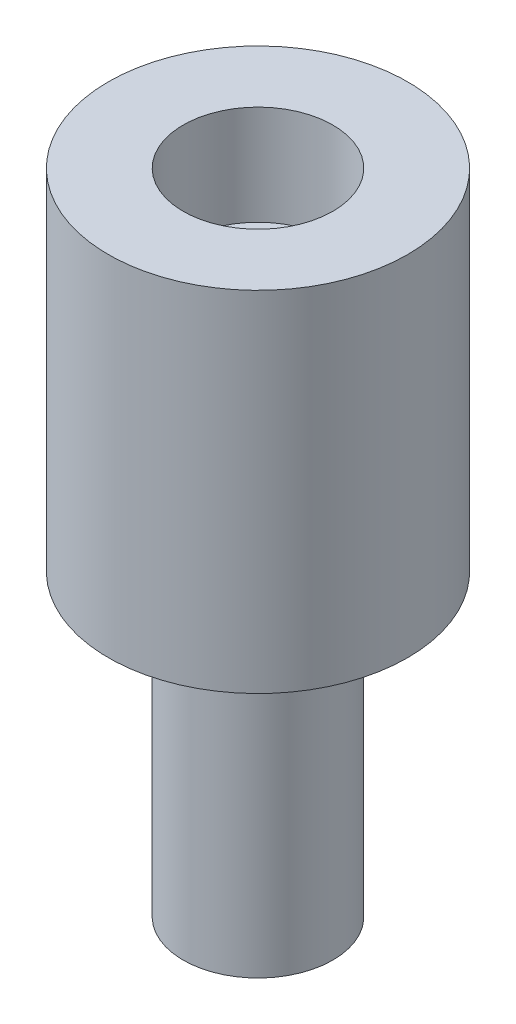
ISO-10303-21;
HEADER;
FILE_DESCRIPTION(('STEP AP214'),'2;1');
FILE_NAME('part.step','',(''),(''),'','','');
FILE_SCHEMA(('AUTOMOTIVE_DESIGN { 1 0 10303 214 1 1 1 1 }'));
ENDSEC;
DATA;
#1=APPLICATION_CONTEXT('core data for automotive mechanical design processes');
#2=APPLICATION_PROTOCOL_DEFINITION('international standard','automotive_design',2000,#1);
#3=PRODUCT_CONTEXT('',#1,'mechanical');
#4=PRODUCT('Part','Part','',(#3));
#5=PRODUCT_RELATED_PRODUCT_CATEGORY('part','',(#4));
#6=PRODUCT_DEFINITION_FORMATION('','',#4);
#7=PRODUCT_DEFINITION_CONTEXT('part definition',#1,'design');
#8=PRODUCT_DEFINITION('design','',#6,#7);
#9=PRODUCT_DEFINITION_SHAPE('','',#8);
#10=(LENGTH_UNIT() NAMED_UNIT(*) SI_UNIT(.MILLI.,.METRE.));
#11=(NAMED_UNIT(*) PLANE_ANGLE_UNIT() SI_UNIT($,.RADIAN.));
#12=(NAMED_UNIT(*) SI_UNIT($,.STERADIAN.) SOLID_ANGLE_UNIT());
#13=UNCERTAINTY_MEASURE_WITH_UNIT(LENGTH_MEASURE(1.E-05),#10,'distance_accuracy_value','');
#14=(GEOMETRIC_REPRESENTATION_CONTEXT(3) GLOBAL_UNCERTAINTY_ASSIGNED_CONTEXT((#13)) GLOBAL_UNIT_ASSIGNED_CONTEXT((#10,
#11,#12)) REPRESENTATION_CONTEXT('',''));
#15=CARTESIAN_POINT('',(0.,0.,0.));
#16=DIRECTION('',(0.,0.,1.));
#17=DIRECTION('',(1.,0.,0.));
#18=AXIS2_PLACEMENT_3D('',#15,#16,#17);
#19=CARTESIAN_POINT('',(0.,11.,0.));
#20=DIRECTION('',(0.,-1.,0.));
#21=DIRECTION('',(1.,0.,0.));
#22=AXIS2_PLACEMENT_3D('',#19,#20,#21);
#23=PLANE('',#22);
#24=CARTESIAN_POINT('',(0.,11.,0.));
#25=DIRECTION('',(0.,-1.,0.));
#26=DIRECTION('',(1.,0.,0.));
#27=AXIS2_PLACEMENT_3D('',#24,#25,#26);
#28=CIRCLE('',#27,1.5);
#29=CARTESIAN_POINT('',(1.5,11.,0.));
#30=VERTEX_POINT('',#29);
#31=EDGE_CURVE('E10',#30,#30,#28,.T.);
#32=ORIENTED_EDGE('',*,*,#31,.F.);
#33=EDGE_LOOP('',(#32));
#34=FACE_BOUND('',#33,.T.);
#35=ADVANCED_FACE('F34',(#34),#23,.F.);
#36=CARTESIAN_POINT('',(0.,0.,0.));
#37=DIRECTION('',(0.,-1.,0.));
#38=DIRECTION('',(1.,0.,0.));
#39=AXIS2_PLACEMENT_3D('',#36,#37,#38);
#40=CYLINDRICAL_SURFACE('',#39,1.5);
#41=CARTESIAN_POINT('',(0.,13.,0.));
#42=DIRECTION('',(0.,-1.,0.));
#43=DIRECTION('',(1.,0.,0.));
#44=AXIS2_PLACEMENT_3D('',#41,#42,#43);
#45=CIRCLE('',#44,1.5);
#46=CARTESIAN_POINT('',(1.5,13.,0.));
#47=VERTEX_POINT('',#46);
#48=EDGE_CURVE('E40',#47,#47,#45,.T.);
#49=ORIENTED_EDGE('',*,*,#48,.F.);
#50=EDGE_LOOP('',(#49));
#51=FACE_BOUND('',#50,.T.);
#52=ORIENTED_EDGE('',*,*,#31,.T.);
#53=EDGE_LOOP('',(#52));
#54=FACE_BOUND('',#53,.T.);
#55=ADVANCED_FACE('F82',(#51,#54),#40,.F.);
#56=CARTESIAN_POINT('',(-1.5,13.,0.));
#57=DIRECTION('',(0.,-1.,0.));
#58=DIRECTION('',(1.,0.,0.));
#59=AXIS2_PLACEMENT_3D('',#56,#57,#58);
#60=PLANE('',#59);
#61=CARTESIAN_POINT('',(0.,13.,0.));
#62=DIRECTION('',(0.,-1.,0.));
#63=DIRECTION('',(1.,0.,0.));
#64=AXIS2_PLACEMENT_3D('',#61,#62,#63);
#65=CIRCLE('',#64,3.);
#66=CARTESIAN_POINT('',(3.,13.,0.));
#67=VERTEX_POINT('',#66);
#68=EDGE_CURVE('E44',#67,#67,#65,.T.);
#69=ORIENTED_EDGE('',*,*,#68,.F.);
#70=EDGE_LOOP('',(#69));
#71=FACE_BOUND('',#70,.T.);
#72=ORIENTED_EDGE('',*,*,#48,.T.);
#73=EDGE_LOOP('',(#72));
#74=FACE_BOUND('',#73,.T.);
#75=ADVANCED_FACE('F77',(#71,#74),#60,.F.);
#76=CARTESIAN_POINT('',(0.,0.,0.));
#77=DIRECTION('',(0.,-1.,0.));
#78=DIRECTION('',(1.,0.,0.));
#79=AXIS2_PLACEMENT_3D('',#76,#77,#78);
#80=CYLINDRICAL_SURFACE('',#79,3.);
#81=CARTESIAN_POINT('',(0.,6.,0.));
#82=DIRECTION('',(0.,-1.,0.));
#83=DIRECTION('',(1.,0.,0.));
#84=AXIS2_PLACEMENT_3D('',#81,#82,#83);
#85=CIRCLE('',#84,3.);
#86=CARTESIAN_POINT('',(3.,6.,0.));
#87=VERTEX_POINT('',#86);
#88=EDGE_CURVE('E48',#87,#87,#85,.T.);
#89=ORIENTED_EDGE('',*,*,#88,.F.);
#90=EDGE_LOOP('',(#89));
#91=FACE_BOUND('',#90,.T.);
#92=ORIENTED_EDGE('',*,*,#68,.T.);
#93=EDGE_LOOP('',(#92));
#94=FACE_BOUND('',#93,.T.);
#95=ADVANCED_FACE('F71',(#91,#94),#80,.T.);
#96=CARTESIAN_POINT('',(-3.,6.,0.));
#97=DIRECTION('',(0.,1.,0.));
#98=DIRECTION('',(-1.,0.,0.));
#99=AXIS2_PLACEMENT_3D('',#96,#97,#98);
#100=PLANE('',#99);
#101=CARTESIAN_POINT('',(0.,6.,0.));
#102=DIRECTION('',(0.,-1.,0.));
#103=DIRECTION('',(1.,0.,0.));
#104=AXIS2_PLACEMENT_3D('',#101,#102,#103);
#105=CIRCLE('',#104,1.5);
#106=CARTESIAN_POINT('',(1.5,6.,0.));
#107=VERTEX_POINT('',#106);
#108=EDGE_CURVE('E53',#107,#107,#105,.T.);
#109=ORIENTED_EDGE('',*,*,#108,.F.);
#110=EDGE_LOOP('',(#109));
#111=FACE_BOUND('',#110,.T.);
#112=ORIENTED_EDGE('',*,*,#88,.T.);
#113=EDGE_LOOP('',(#112));
#114=FACE_BOUND('',#113,.T.);
#115=ADVANCED_FACE('F65',(#111,#114),#100,.F.);
#116=CARTESIAN_POINT('',(0.,0.,0.));
#117=DIRECTION('',(0.,-1.,0.));
#118=DIRECTION('',(1.,0.,0.));
#119=AXIS2_PLACEMENT_3D('',#116,#117,#118);
#120=CYLINDRICAL_SURFACE('',#119,1.50000000000001);
#121=CARTESIAN_POINT('',(0.,0.,0.));
#122=DIRECTION('',(0.,-1.,0.));
#123=DIRECTION('',(1.,0.,0.));
#124=AXIS2_PLACEMENT_3D('',#121,#122,#123);
#125=CIRCLE('',#124,1.50000000000001);
#126=CARTESIAN_POINT('',(1.50000000000001,0.,0.));
#127=VERTEX_POINT('',#126);
#128=EDGE_CURVE('E56',#127,#127,#125,.T.);
#129=ORIENTED_EDGE('',*,*,#128,.F.);
#130=EDGE_LOOP('',(#129));
#131=FACE_BOUND('',#130,.T.);
#132=ORIENTED_EDGE('',*,*,#108,.T.);
#133=EDGE_LOOP('',(#132));
#134=FACE_BOUND('',#133,.T.);
#135=ADVANCED_FACE('F62',(#131,#134),#120,.T.);
#136=CARTESIAN_POINT('',(-1.50000000000001,0.,0.));
#137=DIRECTION('',(0.,1.,0.));
#138=DIRECTION('',(-1.,0.,0.));
#139=AXIS2_PLACEMENT_3D('',#136,#137,#138);
#140=PLANE('',#139);
#141=ORIENTED_EDGE('',*,*,#128,.T.);
#142=EDGE_LOOP('',(#141));
#143=FACE_BOUND('',#142,.T.);
#144=ADVANCED_FACE('F60',(#143),#140,.F.);
#145=CLOSED_SHELL('',(#35,#55,#75,#95,#115,#135,#144));
#146=MANIFOLD_SOLID_BREP('B2',#145);
#147=ADVANCED_BREP_SHAPE_REPRESENTATION('',(#18,#146),#14);
#148=SHAPE_DEFINITION_REPRESENTATION(#9,#147);
ENDSEC;
END-ISO-10303-21;
